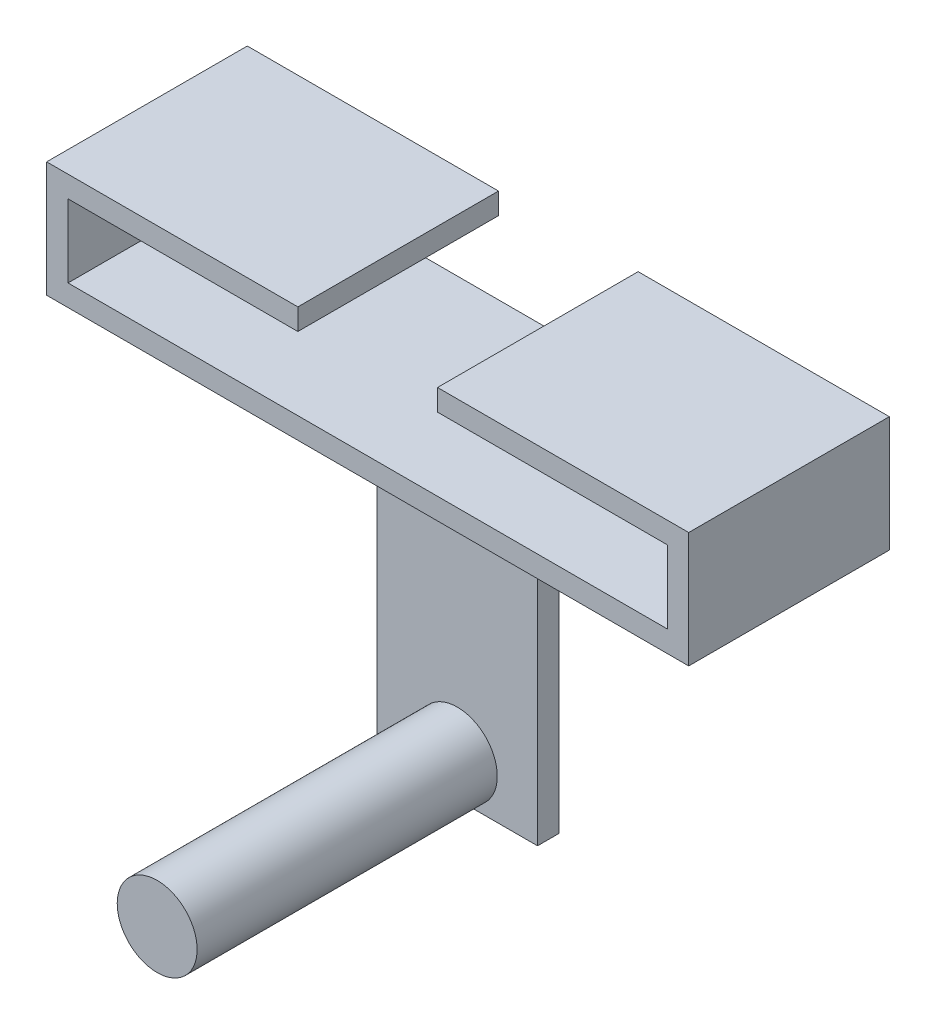
ISO-10303-21;
HEADER;
FILE_DESCRIPTION(('STEP AP214'),'2;1');
FILE_NAME('part.step','',(''),(''),'','','');
FILE_SCHEMA(('AUTOMOTIVE_DESIGN { 1 0 10303 214 1 1 1 1 }'));
ENDSEC;
DATA;
#1=APPLICATION_CONTEXT('core data for automotive mechanical design processes');
#2=APPLICATION_PROTOCOL_DEFINITION('international standard','automotive_design',2000,#1);
#3=PRODUCT_CONTEXT('',#1,'mechanical');
#4=PRODUCT('Part','Part','',(#3));
#5=PRODUCT_RELATED_PRODUCT_CATEGORY('part','',(#4));
#6=PRODUCT_DEFINITION_FORMATION('','',#4);
#7=PRODUCT_DEFINITION_CONTEXT('part definition',#1,'design');
#8=PRODUCT_DEFINITION('design','',#6,#7);
#9=PRODUCT_DEFINITION_SHAPE('','',#8);
#10=(LENGTH_UNIT() NAMED_UNIT(*) SI_UNIT(.MILLI.,.METRE.));
#11=(NAMED_UNIT(*) PLANE_ANGLE_UNIT() SI_UNIT($,.RADIAN.));
#12=(NAMED_UNIT(*) SI_UNIT($,.STERADIAN.) SOLID_ANGLE_UNIT());
#13=UNCERTAINTY_MEASURE_WITH_UNIT(LENGTH_MEASURE(1.E-05),#10,'distance_accuracy_value','');
#14=(GEOMETRIC_REPRESENTATION_CONTEXT(3) GLOBAL_UNCERTAINTY_ASSIGNED_CONTEXT((#13)) GLOBAL_UNIT_ASSIGNED_CONTEXT((#10,
#11,#12)) REPRESENTATION_CONTEXT('',''));
#15=CARTESIAN_POINT('',(0.,0.,0.));
#16=DIRECTION('',(0.,0.,1.));
#17=DIRECTION('',(1.,0.,0.));
#18=AXIS2_PLACEMENT_3D('',#15,#16,#17);
#19=CARTESIAN_POINT('',(0.,0.,0.));
#20=DIRECTION('',(0.,-1.,0.));
#21=DIRECTION('',(0.,0.,-1.));
#22=AXIS2_PLACEMENT_3D('',#19,#20,#21);
#23=PLANE('',#22);
#24=DIRECTION('',(0.,0.,-1.));
#25=VECTOR('',#24,1.);
#26=CARTESIAN_POINT('',(0.,0.,0.));
#27=LINE('',#26,#25);
#28=CARTESIAN_POINT('',(0.,0.,0.));
#29=VERTEX_POINT('',#28);
#30=CARTESIAN_POINT('',(0.,0.,-31.75));
#31=VERTEX_POINT('',#30);
#32=EDGE_CURVE('E263',#29,#31,#27,.T.);
#33=ORIENTED_EDGE('',*,*,#32,.T.);
#34=DIRECTION('',(1.,0.,0.));
#35=VECTOR('',#34,1.);
#36=CARTESIAN_POINT('',(0.,0.,-31.75));
#37=LINE('',#36,#35);
#38=CARTESIAN_POINT('',(101.6,0.,-31.75));
#39=VERTEX_POINT('',#38);
#40=EDGE_CURVE('E295',#31,#39,#37,.T.);
#41=ORIENTED_EDGE('',*,*,#40,.T.);
#42=DIRECTION('',(0.,0.,-1.));
#43=VECTOR('',#42,1.);
#44=CARTESIAN_POINT('',(101.6,0.,0.));
#45=LINE('',#44,#43);
#46=CARTESIAN_POINT('',(101.6,0.,0.));
#47=VERTEX_POINT('',#46);
#48=EDGE_CURVE('E299',#47,#39,#45,.T.);
#49=ORIENTED_EDGE('',*,*,#48,.F.);
#50=DIRECTION('',(1.,0.,0.));
#51=VECTOR('',#50,1.);
#52=CARTESIAN_POINT('',(0.,0.,0.));
#53=LINE('',#52,#51);
#54=EDGE_CURVE('E277',#29,#47,#53,.T.);
#55=ORIENTED_EDGE('',*,*,#54,.F.);
#56=EDGE_LOOP('',(#33,#41,#49,#55));
#57=FACE_BOUND('',#56,.T.);
#58=DIRECTION('',(-1.,0.,0.));
#59=VECTOR('',#58,1.);
#60=CARTESIAN_POINT('',(63.48984,0.,-14.1859));
#61=LINE('',#60,#59);
#62=CARTESIAN_POINT('',(63.48984,0.,-14.1859));
#63=VERTEX_POINT('',#62);
#64=CARTESIAN_POINT('',(38.11016,0.,-14.1859));
#65=VERTEX_POINT('',#64);
#66=EDGE_CURVE('E559',#63,#65,#61,.T.);
#67=ORIENTED_EDGE('',*,*,#66,.F.);
#68=DIRECTION('',(0.,0.,1.));
#69=VECTOR('',#68,1.);
#70=CARTESIAN_POINT('',(63.48984,0.,-17.5641));
#71=LINE('',#70,#69);
#72=CARTESIAN_POINT('',(63.48984,0.,-17.5641));
#73=VERTEX_POINT('',#72);
#74=EDGE_CURVE('E186',#73,#63,#71,.T.);
#75=ORIENTED_EDGE('',*,*,#74,.F.);
#76=DIRECTION('',(1.,0.,0.));
#77=VECTOR('',#76,1.);
#78=CARTESIAN_POINT('',(63.48984,0.,-17.5641));
#79=LINE('',#78,#77);
#80=CARTESIAN_POINT('',(38.11016,0.,-17.5641));
#81=VERTEX_POINT('',#80);
#82=EDGE_CURVE('E182',#81,#73,#79,.T.);
#83=ORIENTED_EDGE('',*,*,#82,.F.);
#84=DIRECTION('',(0.,0.,-1.));
#85=VECTOR('',#84,1.);
#86=CARTESIAN_POINT('',(38.11016,0.,-17.5641));
#87=LINE('',#86,#85);
#88=EDGE_CURVE('E569',#65,#81,#87,.T.);
#89=ORIENTED_EDGE('',*,*,#88,.F.);
#90=EDGE_LOOP('',(#67,#75,#83,#89));
#91=FACE_BOUND('',#90,.T.);
#92=ADVANCED_FACE('F45',(#57,#91),#23,.T.);
#93=CARTESIAN_POINT('',(0.,18.288,0.));
#94=DIRECTION('',(0.,-1.,0.));
#95=DIRECTION('',(0.,0.,-1.));
#96=AXIS2_PLACEMENT_3D('',#93,#94,#95);
#97=PLANE('',#96);
#98=DIRECTION('',(1.,0.,0.));
#99=VECTOR('',#98,1.);
#100=CARTESIAN_POINT('',(0.,18.288,-31.75));
#101=LINE('',#100,#99);
#102=CARTESIAN_POINT('',(61.849,18.288,-31.75));
#103=VERTEX_POINT('',#102);
#104=CARTESIAN_POINT('',(101.6,18.288,-31.75));
#105=VERTEX_POINT('',#104);
#106=EDGE_CURVE('E276',#103,#105,#101,.T.);
#107=ORIENTED_EDGE('',*,*,#106,.F.);
#108=DIRECTION('',(0.,0.,-1.));
#109=VECTOR('',#108,1.);
#110=CARTESIAN_POINT('',(61.849,18.288,-31.75));
#111=LINE('',#110,#109);
#112=CARTESIAN_POINT('',(61.849,18.288,0.));
#113=VERTEX_POINT('',#112);
#114=EDGE_CURVE('E252',#113,#103,#111,.T.);
#115=ORIENTED_EDGE('',*,*,#114,.F.);
#116=DIRECTION('',(1.,0.,0.));
#117=VECTOR('',#116,1.);
#118=CARTESIAN_POINT('',(0.,18.288,0.));
#119=LINE('',#118,#117);
#120=CARTESIAN_POINT('',(101.6,18.288,0.));
#121=VERTEX_POINT('',#120);
#122=EDGE_CURVE('E286',#113,#121,#119,.T.);
#123=ORIENTED_EDGE('',*,*,#122,.T.);
#124=DIRECTION('',(0.,0.,-1.));
#125=VECTOR('',#124,1.);
#126=CARTESIAN_POINT('',(101.6,18.288,0.));
#127=LINE('',#126,#125);
#128=EDGE_CURVE('E282',#121,#105,#127,.T.);
#129=ORIENTED_EDGE('',*,*,#128,.T.);
#130=EDGE_LOOP('',(#107,#115,#123,#129));
#131=FACE_BOUND('',#130,.T.);
#132=ADVANCED_FACE('F337',(#131),#97,.F.);
#133=CARTESIAN_POINT('',(0.,18.288,0.));
#134=DIRECTION('',(-1.,0.,0.));
#135=DIRECTION('',(0.,0.,1.));
#136=AXIS2_PLACEMENT_3D('',#133,#134,#135);
#137=PLANE('',#136);
#138=ORIENTED_EDGE('',*,*,#32,.F.);
#139=DIRECTION('',(0.,-1.,0.));
#140=VECTOR('',#139,1.);
#141=CARTESIAN_POINT('',(0.,18.288,0.));
#142=LINE('',#141,#140);
#143=CARTESIAN_POINT('',(0.,18.288,0.));
#144=VERTEX_POINT('',#143);
#145=EDGE_CURVE('E54',#144,#29,#142,.T.);
#146=ORIENTED_EDGE('',*,*,#145,.F.);
#147=DIRECTION('',(0.,0.,-1.));
#148=VECTOR('',#147,1.);
#149=CARTESIAN_POINT('',(0.,18.288,0.));
#150=LINE('',#149,#148);
#151=CARTESIAN_POINT('',(0.,18.288,-31.75));
#152=VERTEX_POINT('',#151);
#153=EDGE_CURVE('E272',#144,#152,#150,.T.);
#154=ORIENTED_EDGE('',*,*,#153,.T.);
#155=DIRECTION('',(0.,-1.,0.));
#156=VECTOR('',#155,1.);
#157=CARTESIAN_POINT('',(0.,18.288,-31.75));
#158=LINE('',#157,#156);
#159=EDGE_CURVE('E291',#152,#31,#158,.T.);
#160=ORIENTED_EDGE('',*,*,#159,.T.);
#161=EDGE_LOOP('',(#138,#146,#154,#160));
#162=FACE_BOUND('',#161,.T.);
#163=ADVANCED_FACE('F47',(#162),#137,.T.);
#164=CARTESIAN_POINT('',(0.,18.288,0.));
#165=DIRECTION('',(0.,0.,-1.));
#166=DIRECTION('',(-1.,0.,0.));
#167=AXIS2_PLACEMENT_3D('',#164,#165,#166);
#168=PLANE('',#167);
#169=DIRECTION('',(1.,0.,0.));
#170=VECTOR('',#169,1.);
#171=CARTESIAN_POINT('',(39.751,3.3782,0.));
#172=LINE('',#171,#170);
#173=CARTESIAN_POINT('',(3.3782,3.3782,0.));
#174=VERTEX_POINT('',#173);
#175=CARTESIAN_POINT('',(98.2218,3.3782,0.));
#176=VERTEX_POINT('',#175);
#177=EDGE_CURVE('E251',#174,#176,#172,.T.);
#178=ORIENTED_EDGE('',*,*,#177,.F.);
#179=DIRECTION('',(0.,-1.,0.));
#180=VECTOR('',#179,1.);
#181=CARTESIAN_POINT('',(3.3782,3.3782,0.));
#182=LINE('',#181,#180);
#183=CARTESIAN_POINT('',(3.3782,14.9098,0.));
#184=VERTEX_POINT('',#183);
#185=EDGE_CURVE('E205',#184,#174,#182,.T.);
#186=ORIENTED_EDGE('',*,*,#185,.F.);
#187=DIRECTION('',(-1.,0.,0.));
#188=VECTOR('',#187,1.);
#189=CARTESIAN_POINT('',(39.751,14.9098,0.));
#190=LINE('',#189,#188);
#191=CARTESIAN_POINT('',(39.751,14.9098,0.));
#192=VERTEX_POINT('',#191);
#193=EDGE_CURVE('E210',#192,#184,#190,.T.);
#194=ORIENTED_EDGE('',*,*,#193,.F.);
#195=DIRECTION('',(0.,1.,0.));
#196=VECTOR('',#195,1.);
#197=CARTESIAN_POINT('',(39.751,3.3782,0.));
#198=LINE('',#197,#196);
#199=CARTESIAN_POINT('',(39.751,18.288,0.));
#200=VERTEX_POINT('',#199);
#201=EDGE_CURVE('E267',#192,#200,#198,.T.);
#202=ORIENTED_EDGE('',*,*,#201,.T.);
#203=EDGE_CURVE('E287',#144,#200,#119,.T.);
#204=ORIENTED_EDGE('',*,*,#203,.F.);
#205=ORIENTED_EDGE('',*,*,#145,.T.);
#206=ORIENTED_EDGE('',*,*,#54,.T.);
#207=DIRECTION('',(0.,-1.,0.));
#208=VECTOR('',#207,1.);
#209=CARTESIAN_POINT('',(101.6,18.288,0.));
#210=LINE('',#209,#208);
#211=EDGE_CURVE('E307',#121,#47,#210,.T.);
#212=ORIENTED_EDGE('',*,*,#211,.F.);
#213=ORIENTED_EDGE('',*,*,#122,.F.);
#214=DIRECTION('',(0.,1.,0.));
#215=VECTOR('',#214,1.);
#216=CARTESIAN_POINT('',(61.849,3.3782,0.));
#217=LINE('',#216,#215);
#218=CARTESIAN_POINT('',(61.849,14.9098,0.));
#219=VERTEX_POINT('',#218);
#220=EDGE_CURVE('E264',#219,#113,#217,.T.);
#221=ORIENTED_EDGE('',*,*,#220,.F.);
#222=DIRECTION('',(-1.,0.,0.));
#223=VECTOR('',#222,1.);
#224=CARTESIAN_POINT('',(61.849,14.9098,0.));
#225=LINE('',#224,#223);
#226=CARTESIAN_POINT('',(98.2218,14.9098,0.));
#227=VERTEX_POINT('',#226);
#228=EDGE_CURVE('E235',#227,#219,#225,.T.);
#229=ORIENTED_EDGE('',*,*,#228,.F.);
#230=DIRECTION('',(0.,1.,0.));
#231=VECTOR('',#230,1.);
#232=CARTESIAN_POINT('',(98.2218,3.3782,0.));
#233=LINE('',#232,#231);
#234=EDGE_CURVE('E214',#176,#227,#233,.T.);
#235=ORIENTED_EDGE('',*,*,#234,.F.);
#236=EDGE_LOOP('',(#178,#186,#194,#202,#204,#205,#206,#212,#213,#221,#229,#235));
#237=FACE_BOUND('',#236,.T.);
#238=ADVANCED_FACE('F329',(#237),#168,.F.);
#239=CARTESIAN_POINT('',(101.6,18.288,0.));
#240=DIRECTION('',(-1.,0.,0.));
#241=DIRECTION('',(0.,0.,1.));
#242=AXIS2_PLACEMENT_3D('',#239,#240,#241);
#243=PLANE('',#242);
#244=ORIENTED_EDGE('',*,*,#48,.T.);
#245=DIRECTION('',(0.,-1.,0.));
#246=VECTOR('',#245,1.);
#247=CARTESIAN_POINT('',(101.6,18.288,-31.75));
#248=LINE('',#247,#246);
#249=EDGE_CURVE('E311',#105,#39,#248,.T.);
#250=ORIENTED_EDGE('',*,*,#249,.F.);
#251=ORIENTED_EDGE('',*,*,#128,.F.);
#252=ORIENTED_EDGE('',*,*,#211,.T.);
#253=EDGE_LOOP('',(#244,#250,#251,#252));
#254=FACE_BOUND('',#253,.T.);
#255=ADVANCED_FACE('F334',(#254),#243,.F.);
#256=CARTESIAN_POINT('',(0.,18.288,-31.75));
#257=DIRECTION('',(0.,0.,-1.));
#258=DIRECTION('',(-1.,0.,0.));
#259=AXIS2_PLACEMENT_3D('',#256,#257,#258);
#260=PLANE('',#259);
#261=DIRECTION('',(0.,-1.,0.));
#262=VECTOR('',#261,1.);
#263=CARTESIAN_POINT('',(3.3782,3.3782,-31.75));
#264=LINE('',#263,#262);
#265=CARTESIAN_POINT('',(3.3782,14.9098,-31.75));
#266=VERTEX_POINT('',#265);
#267=CARTESIAN_POINT('',(3.3782,3.3782,-31.75));
#268=VERTEX_POINT('',#267);
#269=EDGE_CURVE('E204',#266,#268,#264,.T.);
#270=ORIENTED_EDGE('',*,*,#269,.T.);
#271=DIRECTION('',(-1.,0.,0.));
#272=VECTOR('',#271,1.);
#273=CARTESIAN_POINT('',(39.751,3.3782,-31.75));
#274=LINE('',#273,#272);
#275=CARTESIAN_POINT('',(98.2218,3.3782,-31.75));
#276=VERTEX_POINT('',#275);
#277=EDGE_CURVE('E248',#276,#268,#274,.T.);
#278=ORIENTED_EDGE('',*,*,#277,.F.);
#279=DIRECTION('',(0.,1.,0.));
#280=VECTOR('',#279,1.);
#281=CARTESIAN_POINT('',(98.2218,3.3782,-31.75));
#282=LINE('',#281,#280);
#283=CARTESIAN_POINT('',(98.2218,14.9098,-31.75));
#284=VERTEX_POINT('',#283);
#285=EDGE_CURVE('E238',#276,#284,#282,.T.);
#286=ORIENTED_EDGE('',*,*,#285,.T.);
#287=DIRECTION('',(-1.,0.,0.));
#288=VECTOR('',#287,1.);
#289=CARTESIAN_POINT('',(61.849,14.9098,-31.75));
#290=LINE('',#289,#288);
#291=CARTESIAN_POINT('',(61.849,14.9098,-31.75));
#292=VERTEX_POINT('',#291);
#293=EDGE_CURVE('E232',#284,#292,#290,.T.);
#294=ORIENTED_EDGE('',*,*,#293,.T.);
#295=DIRECTION('',(0.,1.,0.));
#296=VECTOR('',#295,1.);
#297=CARTESIAN_POINT('',(61.849,3.3782,-31.75));
#298=LINE('',#297,#296);
#299=EDGE_CURVE('E260',#292,#103,#298,.T.);
#300=ORIENTED_EDGE('',*,*,#299,.T.);
#301=ORIENTED_EDGE('',*,*,#106,.T.);
#302=ORIENTED_EDGE('',*,*,#249,.T.);
#303=ORIENTED_EDGE('',*,*,#40,.F.);
#304=ORIENTED_EDGE('',*,*,#159,.F.);
#305=CARTESIAN_POINT('',(39.751,18.288,-31.75));
#306=VERTEX_POINT('',#305);
#307=EDGE_CURVE('E278',#152,#306,#101,.T.);
#308=ORIENTED_EDGE('',*,*,#307,.T.);
#309=DIRECTION('',(0.,1.,0.));
#310=VECTOR('',#309,1.);
#311=CARTESIAN_POINT('',(39.751,3.3782,-31.75));
#312=LINE('',#311,#310);
#313=CARTESIAN_POINT('',(39.751,14.9098,-31.75));
#314=VERTEX_POINT('',#313);
#315=EDGE_CURVE('E69',#314,#306,#312,.T.);
#316=ORIENTED_EDGE('',*,*,#315,.F.);
#317=DIRECTION('',(-1.,0.,0.));
#318=VECTOR('',#317,1.);
#319=CARTESIAN_POINT('',(39.751,14.9098,-31.75));
#320=LINE('',#319,#318);
#321=EDGE_CURVE('E200',#314,#266,#320,.T.);
#322=ORIENTED_EDGE('',*,*,#321,.T.);
#323=EDGE_LOOP('',(#270,#278,#286,#294,#300,#301,#302,#303,#304,#308,#316,#322));
#324=FACE_BOUND('',#323,.T.);
#325=ADVANCED_FACE('F321',(#324),#260,.T.);
#326=ORIENTED_EDGE('',*,*,#203,.T.);
#327=DIRECTION('',(0.,0.,1.));
#328=VECTOR('',#327,1.);
#329=CARTESIAN_POINT('',(39.751,18.288,0.));
#330=LINE('',#329,#328);
#331=EDGE_CURVE('E222',#306,#200,#330,.T.);
#332=ORIENTED_EDGE('',*,*,#331,.F.);
#333=ORIENTED_EDGE('',*,*,#307,.F.);
#334=ORIENTED_EDGE('',*,*,#153,.F.);
#335=EDGE_LOOP('',(#326,#332,#333,#334));
#336=FACE_BOUND('',#335,.T.);
#337=ADVANCED_FACE('F399',(#336),#97,.F.);
#338=CARTESIAN_POINT('',(61.849,3.3782,-31.75));
#339=DIRECTION('',(1.,0.,0.));
#340=DIRECTION('',(0.,0.,-1.));
#341=AXIS2_PLACEMENT_3D('',#338,#339,#340);
#342=PLANE('',#341);
#343=ORIENTED_EDGE('',*,*,#299,.F.);
#344=DIRECTION('',(0.,0.,1.));
#345=VECTOR('',#344,1.);
#346=CARTESIAN_POINT('',(61.849,14.9098,-31.75));
#347=LINE('',#346,#345);
#348=EDGE_CURVE('E189',#292,#219,#347,.T.);
#349=ORIENTED_EDGE('',*,*,#348,.T.);
#350=ORIENTED_EDGE('',*,*,#220,.T.);
#351=ORIENTED_EDGE('',*,*,#114,.T.);
#352=EDGE_LOOP('',(#343,#349,#350,#351));
#353=FACE_BOUND('',#352,.T.);
#354=ADVANCED_FACE('F377',(#353),#342,.F.);
#355=CARTESIAN_POINT('',(39.751,3.3782,0.));
#356=DIRECTION('',(-1.,0.,0.));
#357=DIRECTION('',(0.,0.,1.));
#358=AXIS2_PLACEMENT_3D('',#355,#356,#357);
#359=PLANE('',#358);
#360=ORIENTED_EDGE('',*,*,#201,.F.);
#361=DIRECTION('',(0.,0.,1.));
#362=VECTOR('',#361,1.);
#363=CARTESIAN_POINT('',(39.751,14.9098,-31.75));
#364=LINE('',#363,#362);
#365=EDGE_CURVE('E209',#314,#192,#364,.T.);
#366=ORIENTED_EDGE('',*,*,#365,.F.);
#367=ORIENTED_EDGE('',*,*,#315,.T.);
#368=ORIENTED_EDGE('',*,*,#331,.T.);
#369=EDGE_LOOP('',(#360,#366,#367,#368));
#370=FACE_BOUND('',#369,.T.);
#371=ADVANCED_FACE('F397',(#370),#359,.F.);
#372=CARTESIAN_POINT('',(0.,3.3782,0.));
#373=DIRECTION('',(0.,-1.,0.));
#374=DIRECTION('',(0.,0.,-1.));
#375=AXIS2_PLACEMENT_3D('',#372,#373,#374);
#376=PLANE('',#375);
#377=ORIENTED_EDGE('',*,*,#277,.T.);
#378=DIRECTION('',(0.,0.,1.));
#379=VECTOR('',#378,1.);
#380=CARTESIAN_POINT('',(3.3782,3.3782,-31.75));
#381=LINE('',#380,#379);
#382=EDGE_CURVE('E218',#268,#174,#381,.T.);
#383=ORIENTED_EDGE('',*,*,#382,.T.);
#384=ORIENTED_EDGE('',*,*,#177,.T.);
#385=DIRECTION('',(0.,0.,1.));
#386=VECTOR('',#385,1.);
#387=CARTESIAN_POINT('',(98.2218,3.3782,-31.75));
#388=LINE('',#387,#386);
#389=EDGE_CURVE('E228',#276,#176,#388,.T.);
#390=ORIENTED_EDGE('',*,*,#389,.F.);
#391=EDGE_LOOP('',(#377,#383,#384,#390));
#392=FACE_BOUND('',#391,.T.);
#393=ADVANCED_FACE('F387',(#392),#376,.F.);
#394=CARTESIAN_POINT('',(61.849,14.9098,-31.75));
#395=DIRECTION('',(0.,1.,0.));
#396=DIRECTION('',(-1.,0.,0.));
#397=AXIS2_PLACEMENT_3D('',#394,#395,#396);
#398=PLANE('',#397);
#399=ORIENTED_EDGE('',*,*,#228,.T.);
#400=ORIENTED_EDGE('',*,*,#348,.F.);
#401=ORIENTED_EDGE('',*,*,#293,.F.);
#402=DIRECTION('',(0.,0.,1.));
#403=VECTOR('',#402,1.);
#404=CARTESIAN_POINT('',(98.2218,14.9098,-31.75));
#405=LINE('',#404,#403);
#406=EDGE_CURVE('E195',#284,#227,#405,.T.);
#407=ORIENTED_EDGE('',*,*,#406,.T.);
#408=EDGE_LOOP('',(#399,#400,#401,#407));
#409=FACE_BOUND('',#408,.T.);
#410=ADVANCED_FACE('F381',(#409),#398,.F.);
#411=CARTESIAN_POINT('',(98.2218,3.3782,-31.75));
#412=DIRECTION('',(1.,0.,0.));
#413=DIRECTION('',(0.,0.,-1.));
#414=AXIS2_PLACEMENT_3D('',#411,#412,#413);
#415=PLANE('',#414);
#416=ORIENTED_EDGE('',*,*,#234,.T.);
#417=ORIENTED_EDGE('',*,*,#406,.F.);
#418=ORIENTED_EDGE('',*,*,#285,.F.);
#419=ORIENTED_EDGE('',*,*,#389,.T.);
#420=EDGE_LOOP('',(#416,#417,#418,#419));
#421=FACE_BOUND('',#420,.T.);
#422=ADVANCED_FACE('F384',(#421),#415,.F.);
#423=CARTESIAN_POINT('',(3.3782,3.3782,-31.75));
#424=DIRECTION('',(-1.,0.,0.));
#425=DIRECTION('',(0.,0.,1.));
#426=AXIS2_PLACEMENT_3D('',#423,#424,#425);
#427=PLANE('',#426);
#428=ORIENTED_EDGE('',*,*,#185,.T.);
#429=ORIENTED_EDGE('',*,*,#382,.F.);
#430=ORIENTED_EDGE('',*,*,#269,.F.);
#431=DIRECTION('',(0.,0.,1.));
#432=VECTOR('',#431,1.);
#433=CARTESIAN_POINT('',(3.3782,14.9098,-31.75));
#434=LINE('',#433,#432);
#435=EDGE_CURVE('E223',#266,#184,#434,.T.);
#436=ORIENTED_EDGE('',*,*,#435,.T.);
#437=EDGE_LOOP('',(#428,#429,#430,#436));
#438=FACE_BOUND('',#437,.T.);
#439=ADVANCED_FACE('F393',(#438),#427,.F.);
#440=CARTESIAN_POINT('',(39.751,14.9098,-31.75));
#441=DIRECTION('',(0.,1.,0.));
#442=DIRECTION('',(-1.,0.,0.));
#443=AXIS2_PLACEMENT_3D('',#440,#441,#442);
#444=PLANE('',#443);
#445=ORIENTED_EDGE('',*,*,#193,.T.);
#446=ORIENTED_EDGE('',*,*,#435,.F.);
#447=ORIENTED_EDGE('',*,*,#321,.F.);
#448=ORIENTED_EDGE('',*,*,#365,.T.);
#449=EDGE_LOOP('',(#445,#446,#447,#448));
#450=FACE_BOUND('',#449,.T.);
#451=ADVANCED_FACE('F396',(#450),#444,.F.);
#452=CARTESIAN_POINT('',(63.48984,-50.8,-17.5641));
#453=DIRECTION('',(-1.,0.,0.));
#454=DIRECTION('',(0.,0.,1.));
#455=AXIS2_PLACEMENT_3D('',#452,#453,#454);
#456=PLANE('',#455);
#457=ORIENTED_EDGE('',*,*,#74,.T.);
#458=DIRECTION('',(0.,1.,0.));
#459=VECTOR('',#458,1.);
#460=CARTESIAN_POINT('',(63.48984,-50.8,-14.1859));
#461=LINE('',#460,#459);
#462=CARTESIAN_POINT('',(63.48984,-50.8,-14.1859));
#463=VERTEX_POINT('',#462);
#464=EDGE_CURVE('E165',#463,#63,#461,.T.);
#465=ORIENTED_EDGE('',*,*,#464,.F.);
#466=DIRECTION('',(0.,0.,1.));
#467=VECTOR('',#466,1.);
#468=CARTESIAN_POINT('',(63.48984,-50.8,-17.5641));
#469=LINE('',#468,#467);
#470=CARTESIAN_POINT('',(63.48984,-50.8,-17.5641));
#471=VERTEX_POINT('',#470);
#472=EDGE_CURVE('E173',#471,#463,#469,.T.);
#473=ORIENTED_EDGE('',*,*,#472,.F.);
#474=DIRECTION('',(0.,1.,0.));
#475=VECTOR('',#474,1.);
#476=CARTESIAN_POINT('',(63.48984,-50.8,-17.5641));
#477=LINE('',#476,#475);
#478=EDGE_CURVE('E565',#471,#73,#477,.T.);
#479=ORIENTED_EDGE('',*,*,#478,.T.);
#480=EDGE_LOOP('',(#457,#465,#473,#479));
#481=FACE_BOUND('',#480,.T.);
#482=ADVANCED_FACE('F184',(#481),#456,.F.);
#483=CARTESIAN_POINT('',(63.48984,-50.8,-14.1859));
#484=DIRECTION('',(0.,0.,-1.));
#485=DIRECTION('',(-1.,0.,0.));
#486=AXIS2_PLACEMENT_3D('',#483,#484,#485);
#487=PLANE('',#486);
#488=CARTESIAN_POINT('',(50.8,-44.45,-14.1859));
#489=DIRECTION('',(0.,0.,-1.));
#490=DIRECTION('',(-1.,0.,0.));
#491=AXIS2_PLACEMENT_3D('',#488,#489,#490);
#492=CIRCLE('',#491,6.3246);
#493=CARTESIAN_POINT('',(44.4754,-44.45,-14.1859));
#494=VERTEX_POINT('',#493);
#495=EDGE_CURVE('E11',#494,#494,#492,.F.);
#496=ORIENTED_EDGE('',*,*,#495,.F.);
#497=EDGE_LOOP('',(#496));
#498=FACE_BOUND('',#497,.T.);
#499=ORIENTED_EDGE('',*,*,#66,.T.);
#500=DIRECTION('',(0.,1.,0.));
#501=VECTOR('',#500,1.);
#502=CARTESIAN_POINT('',(38.11016,-50.8,-14.1859));
#503=LINE('',#502,#501);
#504=CARTESIAN_POINT('',(38.11016,-50.8,-14.1859));
#505=VERTEX_POINT('',#504);
#506=EDGE_CURVE('E168',#505,#65,#503,.T.);
#507=ORIENTED_EDGE('',*,*,#506,.F.);
#508=DIRECTION('',(-1.,0.,0.));
#509=VECTOR('',#508,1.);
#510=CARTESIAN_POINT('',(63.48984,-50.8,-14.1859));
#511=LINE('',#510,#509);
#512=EDGE_CURVE('E161',#463,#505,#511,.T.);
#513=ORIENTED_EDGE('',*,*,#512,.F.);
#514=ORIENTED_EDGE('',*,*,#464,.T.);
#515=EDGE_LOOP('',(#499,#507,#513,#514));
#516=FACE_BOUND('',#515,.T.);
#517=ADVANCED_FACE('F163',(#498,#516),#487,.F.);
#518=CARTESIAN_POINT('',(38.11016,-50.8,-17.5641));
#519=DIRECTION('',(1.,0.,0.));
#520=DIRECTION('',(0.,0.,-1.));
#521=AXIS2_PLACEMENT_3D('',#518,#519,#520);
#522=PLANE('',#521);
#523=ORIENTED_EDGE('',*,*,#88,.T.);
#524=DIRECTION('',(0.,1.,0.));
#525=VECTOR('',#524,1.);
#526=CARTESIAN_POINT('',(38.11016,-50.8,-17.5641));
#527=LINE('',#526,#525);
#528=CARTESIAN_POINT('',(38.11016,-50.8,-17.5641));
#529=VERTEX_POINT('',#528);
#530=EDGE_CURVE('E61',#529,#81,#527,.T.);
#531=ORIENTED_EDGE('',*,*,#530,.F.);
#532=DIRECTION('',(0.,0.,-1.));
#533=VECTOR('',#532,1.);
#534=CARTESIAN_POINT('',(38.11016,-50.8,-17.5641));
#535=LINE('',#534,#533);
#536=EDGE_CURVE('E172',#505,#529,#535,.T.);
#537=ORIENTED_EDGE('',*,*,#536,.F.);
#538=ORIENTED_EDGE('',*,*,#506,.T.);
#539=EDGE_LOOP('',(#523,#531,#537,#538));
#540=FACE_BOUND('',#539,.T.);
#541=ADVANCED_FACE('F500',(#540),#522,.F.);
#542=CARTESIAN_POINT('',(63.48984,-50.8,-17.5641));
#543=DIRECTION('',(0.,0.,1.));
#544=DIRECTION('',(1.,0.,0.));
#545=AXIS2_PLACEMENT_3D('',#542,#543,#544);
#546=PLANE('',#545);
#547=ORIENTED_EDGE('',*,*,#82,.T.);
#548=ORIENTED_EDGE('',*,*,#478,.F.);
#549=DIRECTION('',(1.,0.,0.));
#550=VECTOR('',#549,1.);
#551=CARTESIAN_POINT('',(63.48984,-50.8,-17.5641));
#552=LINE('',#551,#550);
#553=EDGE_CURVE('E177',#529,#471,#552,.T.);
#554=ORIENTED_EDGE('',*,*,#553,.F.);
#555=ORIENTED_EDGE('',*,*,#530,.T.);
#556=EDGE_LOOP('',(#547,#548,#554,#555));
#557=FACE_BOUND('',#556,.T.);
#558=ADVANCED_FACE('F509',(#557),#546,.F.);
#559=CARTESIAN_POINT('',(0.,-50.8,0.));
#560=DIRECTION('',(0.,-1.,0.));
#561=DIRECTION('',(0.,0.,-1.));
#562=AXIS2_PLACEMENT_3D('',#559,#560,#561);
#563=PLANE('',#562);
#564=ORIENTED_EDGE('',*,*,#472,.T.);
#565=ORIENTED_EDGE('',*,*,#512,.T.);
#566=ORIENTED_EDGE('',*,*,#536,.T.);
#567=ORIENTED_EDGE('',*,*,#553,.T.);
#568=EDGE_LOOP('',(#564,#565,#566,#567));
#569=FACE_BOUND('',#568,.T.);
#570=ADVANCED_FACE('F176',(#569),#563,.T.);
#571=CARTESIAN_POINT('',(50.8,-44.45,33.3121));
#572=DIRECTION('',(0.,0.,-1.));
#573=DIRECTION('',(-1.,0.,0.));
#574=AXIS2_PLACEMENT_3D('',#571,#572,#573);
#575=CYLINDRICAL_SURFACE('',#574,6.3246);
#576=CARTESIAN_POINT('',(50.8,-44.45,33.3121));
#577=DIRECTION('',(0.,0.,1.));
#578=DIRECTION('',(1.,0.,0.));
#579=AXIS2_PLACEMENT_3D('',#576,#577,#578);
#580=CIRCLE('',#579,6.3246);
#581=CARTESIAN_POINT('',(44.4754,-44.45,33.3121));
#582=VERTEX_POINT('',#581);
#583=EDGE_CURVE('E554',#582,#582,#580,.T.);
#584=CARTESIAN_POINT('',(44.4754,-44.45,33.3121));
#585=CARTESIAN_POINT('',(44.4754,-44.45,32.8173291666667));
#586=CARTESIAN_POINT('',(44.4754,-44.45,32.3225583333333));
#587=CARTESIAN_POINT('',(44.4754,-44.45,31.3330166666667));
#588=CARTESIAN_POINT('',(44.4754,-44.45,30.8382458333333));
#589=CARTESIAN_POINT('',(44.4754,-44.45,29.8487041666667));
#590=CARTESIAN_POINT('',(44.4754,-44.45,29.3539333333333));
#591=CARTESIAN_POINT('',(44.4754,-44.45,28.3643916666667));
#592=CARTESIAN_POINT('',(44.4754,-44.45,27.8696208333333));
#593=CARTESIAN_POINT('',(44.4754,-44.45,26.8800791666667));
#594=CARTESIAN_POINT('',(44.4754,-44.45,26.3853083333333));
#595=CARTESIAN_POINT('',(44.4754,-44.45,25.3957666666667));
#596=CARTESIAN_POINT('',(44.4754,-44.45,24.9009958333333));
#597=CARTESIAN_POINT('',(44.4754,-44.45,23.9114541666667));
#598=CARTESIAN_POINT('',(44.4754,-44.45,23.4166833333333));
#599=CARTESIAN_POINT('',(44.4754,-44.45,22.4271416666667));
#600=CARTESIAN_POINT('',(44.4754,-44.45,21.9323708333333));
#601=CARTESIAN_POINT('',(44.4754,-44.45,20.9428291666667));
#602=CARTESIAN_POINT('',(44.4754,-44.45,20.4480583333333));
#603=CARTESIAN_POINT('',(44.4754,-44.45,19.4585166666667));
#604=CARTESIAN_POINT('',(44.4754,-44.45,18.9637458333333));
#605=CARTESIAN_POINT('',(44.4754,-44.45,17.9742041666667));
#606=CARTESIAN_POINT('',(44.4754,-44.45,17.4794333333333));
#607=CARTESIAN_POINT('',(44.4754,-44.45,16.4898916666667));
#608=CARTESIAN_POINT('',(44.4754,-44.45,15.9951208333333));
#609=CARTESIAN_POINT('',(44.4754,-44.45,15.0055791666667));
#610=CARTESIAN_POINT('',(44.4754,-44.45,14.5108083333333));
#611=CARTESIAN_POINT('',(44.4754,-44.45,13.5212666666667));
#612=CARTESIAN_POINT('',(44.4754,-44.45,13.0264958333333));
#613=CARTESIAN_POINT('',(44.4754,-44.45,12.0369541666667));
#614=CARTESIAN_POINT('',(44.4754,-44.45,11.5421833333333));
#615=CARTESIAN_POINT('',(44.4754,-44.45,10.5526416666667));
#616=CARTESIAN_POINT('',(44.4754,-44.45,10.0578708333333));
#617=CARTESIAN_POINT('',(44.4754,-44.45,9.06832916666667));
#618=CARTESIAN_POINT('',(44.4754,-44.45,8.57355833333333));
#619=CARTESIAN_POINT('',(44.4754,-44.45,7.58401666666667));
#620=CARTESIAN_POINT('',(44.4754,-44.45,7.08924583333333));
#621=CARTESIAN_POINT('',(44.4754,-44.45,6.09970416666667));
#622=CARTESIAN_POINT('',(44.4754,-44.45,5.60493333333334));
#623=CARTESIAN_POINT('',(44.4754,-44.45,4.61539166666667));
#624=CARTESIAN_POINT('',(44.4754,-44.45,4.12062083333334));
#625=CARTESIAN_POINT('',(44.4754,-44.45,3.13107916666667));
#626=CARTESIAN_POINT('',(44.4754,-44.45,2.63630833333334));
#627=CARTESIAN_POINT('',(44.4754,-44.45,1.64676666666667));
#628=CARTESIAN_POINT('',(44.4754,-44.45,1.15199583333334));
#629=CARTESIAN_POINT('',(44.4754,-44.45,0.162454166666671));
#630=CARTESIAN_POINT('',(44.4754,-44.45,-0.332316666666663));
#631=CARTESIAN_POINT('',(44.4754,-44.45,-1.32185833333333));
#632=CARTESIAN_POINT('',(44.4754,-44.45,-1.81662916666666));
#633=CARTESIAN_POINT('',(44.4754,-44.45,-2.80617083333333));
#634=CARTESIAN_POINT('',(44.4754,-44.45,-3.30094166666667));
#635=CARTESIAN_POINT('',(44.4754,-44.45,-4.29048333333333));
#636=CARTESIAN_POINT('',(44.4754,-44.45,-4.78525416666666));
#637=CARTESIAN_POINT('',(44.4754,-44.45,-5.77479583333333));
#638=CARTESIAN_POINT('',(44.4754,-44.45,-6.26956666666666));
#639=CARTESIAN_POINT('',(44.4754,-44.45,-7.25910833333333));
#640=CARTESIAN_POINT('',(44.4754,-44.45,-7.75387916666666));
#641=CARTESIAN_POINT('',(44.4754,-44.45,-8.74342083333333));
#642=CARTESIAN_POINT('',(44.4754,-44.45,-9.23819166666666));
#643=CARTESIAN_POINT('',(44.4754,-44.45,-10.2277333333333));
#644=CARTESIAN_POINT('',(44.4754,-44.45,-10.7225041666667));
#645=CARTESIAN_POINT('',(44.4754,-44.45,-11.7120458333333));
#646=CARTESIAN_POINT('',(44.4754,-44.45,-12.2068166666667));
#647=CARTESIAN_POINT('',(44.4754,-44.45,-13.1963583333333));
#648=CARTESIAN_POINT('',(44.4754,-44.45,-13.6911291666667));
#649=CARTESIAN_POINT('',(44.4754,-44.45,-14.1859));
#650=B_SPLINE_CURVE_WITH_KNOTS('',3,(#584,#585,#586,#587,#588,#589,#590,#591,#592,#593,#594,
#595,#596,#597,#598,#599,#600,#601,#602,#603,#604,#605,#606,#607,#608,#609,#610,#611,#612,#613,
#614,#615,#616,#617,#618,#619,#620,#621,#622,#623,#624,#625,#626,#627,#628,#629,#630,#631,#632,
#633,#634,#635,#636,#637,#638,#639,#640,#641,#642,#643,#644,#645,#646,#647,#648,#649),
.UNSPECIFIED.,.F.,.F.,(4,2,2,2,2,2,2,2,2,2,2,2,2,2,2,2,2,2,2,2,2,2,2,2,2,2,2,2,2,2,2,2,4),(0.,
1.48431249999999,2.968625,4.4529375,5.93724999999999,7.42156249999999,8.90587499999999,
10.3901875,11.8745,13.3588125,14.843125,16.3274375,17.81175,19.2960625,20.780375,22.2646875,
23.749,25.2333125,26.717625,28.2019375,29.68625,31.1705625,32.654875,34.1391875,35.6235,
37.1078125,38.592125,40.0764375,41.56075,43.0450625,44.529375,46.0136875,47.498),.UNSPECIFIED.);
#651=EDGE_CURVE('BSEAM525',#582,#494,#650,.T.);
#652=ORIENTED_EDGE('',*,*,#583,.F.);
#653=ORIENTED_EDGE('',*,*,#495,.T.);
#654=ORIENTED_EDGE('',*,*,#651,.T.);
#655=ORIENTED_EDGE('',*,*,#651,.F.);
#656=EDGE_LOOP('',(#652,#654,#653,#655));
#657=FACE_BOUND('',#656,.T.);
#658=ADVANCED_FACE('F525',(#657),#575,.T.);
#659=CARTESIAN_POINT('',(50.8,-44.45,33.3121));
#660=DIRECTION('',(0.,0.,1.));
#661=DIRECTION('',(1.,0.,0.));
#662=AXIS2_PLACEMENT_3D('',#659,#660,#661);
#663=PLANE('',#662);
#664=ORIENTED_EDGE('',*,*,#583,.T.);
#665=EDGE_LOOP('',(#664));
#666=FACE_BOUND('',#665,.T.);
#667=ADVANCED_FACE('F533',(#666),#663,.T.);
#668=CLOSED_SHELL('',(#92,#132,#163,#238,#255,#325,#337,#354,#371,#393,#410,#422,#439,#451,#482,
#517,#541,#558,#570,#658,#667));
#669=MANIFOLD_SOLID_BREP('B2',#668);
#670=ADVANCED_BREP_SHAPE_REPRESENTATION('',(#18,#669),#14);
#671=SHAPE_DEFINITION_REPRESENTATION(#9,#670);
ENDSEC;
END-ISO-10303-21;
